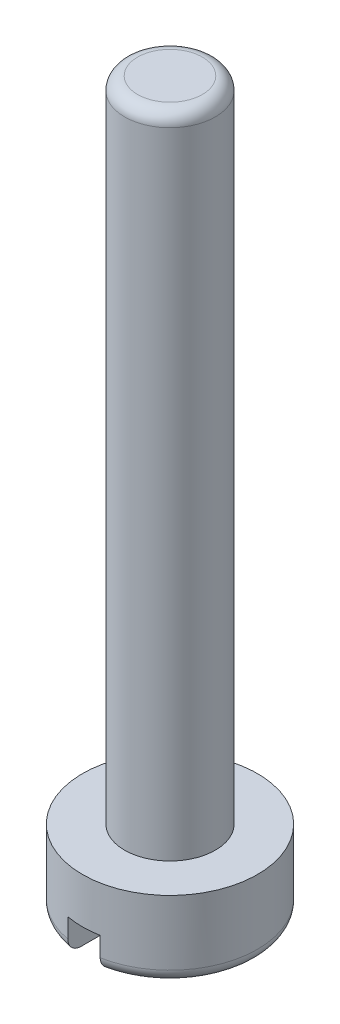
ISO-10303-21;
HEADER;
FILE_DESCRIPTION(('STEP AP214'),'2;1');
FILE_NAME('part.step','',(''),(''),'','','');
FILE_SCHEMA(('AUTOMOTIVE_DESIGN { 1 0 10303 214 1 1 1 1 }'));
ENDSEC;
DATA;
#1=APPLICATION_CONTEXT('core data for automotive mechanical design processes');
#2=APPLICATION_PROTOCOL_DEFINITION('international standard','automotive_design',2000,#1);
#3=PRODUCT_CONTEXT('',#1,'mechanical');
#4=PRODUCT('Part','Part','',(#3));
#5=PRODUCT_RELATED_PRODUCT_CATEGORY('part','',(#4));
#6=PRODUCT_DEFINITION_FORMATION('','',#4);
#7=PRODUCT_DEFINITION_CONTEXT('part definition',#1,'design');
#8=PRODUCT_DEFINITION('design','',#6,#7);
#9=PRODUCT_DEFINITION_SHAPE('','',#8);
#10=(LENGTH_UNIT() NAMED_UNIT(*) SI_UNIT(.MILLI.,.METRE.));
#11=(NAMED_UNIT(*) PLANE_ANGLE_UNIT() SI_UNIT($,.RADIAN.));
#12=(NAMED_UNIT(*) SI_UNIT($,.STERADIAN.) SOLID_ANGLE_UNIT());
#13=UNCERTAINTY_MEASURE_WITH_UNIT(LENGTH_MEASURE(1.E-05),#10,'distance_accuracy_value','');
#14=(GEOMETRIC_REPRESENTATION_CONTEXT(3) GLOBAL_UNCERTAINTY_ASSIGNED_CONTEXT((#13)) GLOBAL_UNIT_ASSIGNED_CONTEXT((#10,
#11,#12)) REPRESENTATION_CONTEXT('',''));
#15=CARTESIAN_POINT('',(0.,0.,0.));
#16=DIRECTION('',(0.,0.,1.));
#17=DIRECTION('',(1.,0.,0.));
#18=AXIS2_PLACEMENT_3D('',#15,#16,#17);
#19=CARTESIAN_POINT('',(0.,1.2,0.));
#20=DIRECTION('',(0.,-1.,0.));
#21=DIRECTION('',(0.,0.,-1.));
#22=AXIS2_PLACEMENT_3D('',#19,#20,#21);
#23=CYLINDRICAL_SURFACE('',#22,1.35);
#24=CARTESIAN_POINT('',(0.,1.2,0.));
#25=DIRECTION('',(0.,1.,0.));
#26=DIRECTION('',(0.,0.,1.));
#27=AXIS2_PLACEMENT_3D('',#24,#25,#26);
#28=CIRCLE('',#27,1.35);
#29=CARTESIAN_POINT('',(0.,1.2,1.35));
#30=VERTEX_POINT('',#29);
#31=EDGE_CURVE('E198',#30,#30,#28,.T.);
#32=ORIENTED_EDGE('',*,*,#31,.F.);
#33=EDGE_LOOP('',(#32));
#34=FACE_BOUND('',#33,.T.);
#35=DIRECTION('',(0.,-1.,0.));
#36=VECTOR('',#35,1.);
#37=CARTESIAN_POINT('',(0.249999999999999,1.2,1.32664991614216));
#38=LINE('',#37,#36);
#39=CARTESIAN_POINT('',(0.249999999999999,0.2,1.32664991614216));
#40=VERTEX_POINT('',#39);
#41=CARTESIAN_POINT('',(0.25,0.5,1.32664991614216));
#42=VERTEX_POINT('',#41);
#43=EDGE_CURVE('E84',#40,#42,#38,.F.);
#44=ORIENTED_EDGE('',*,*,#43,.F.);
#45=CARTESIAN_POINT('',(0.,0.2,0.));
#46=DIRECTION('',(0.,1.,0.));
#47=DIRECTION('',(0.,0.,1.));
#48=AXIS2_PLACEMENT_3D('',#45,#46,#47);
#49=CIRCLE('',#48,1.35);
#50=CARTESIAN_POINT('',(0.249999999999999,0.2,-1.32664991614216));
#51=VERTEX_POINT('',#50);
#52=EDGE_CURVE('E125',#40,#51,#49,.T.);
#53=ORIENTED_EDGE('',*,*,#52,.T.);
#54=DIRECTION('',(0.,-1.,0.));
#55=VECTOR('',#54,1.);
#56=CARTESIAN_POINT('',(0.249999999999999,1.2,-1.32664991614216));
#57=LINE('',#56,#55);
#58=CARTESIAN_POINT('',(0.25,0.5,-1.32664991614216));
#59=VERTEX_POINT('',#58);
#60=EDGE_CURVE('E97',#59,#51,#57,.T.);
#61=ORIENTED_EDGE('',*,*,#60,.F.);
#62=CARTESIAN_POINT('',(0.,0.5,0.));
#63=DIRECTION('',(0.,-1.,0.));
#64=DIRECTION('',(1.,0.,0.));
#65=AXIS2_PLACEMENT_3D('',#62,#63,#64);
#66=CIRCLE('',#65,1.35);
#67=CARTESIAN_POINT('',(-0.25,0.5,-1.32664991614216));
#68=VERTEX_POINT('',#67);
#69=EDGE_CURVE('E106',#68,#59,#66,.T.);
#70=ORIENTED_EDGE('',*,*,#69,.F.);
#71=DIRECTION('',(0.,-1.,0.));
#72=VECTOR('',#71,1.);
#73=CARTESIAN_POINT('',(-0.25,1.2,-1.32664991614216));
#74=LINE('',#73,#72);
#75=CARTESIAN_POINT('',(-0.25,0.2,-1.32664991614216));
#76=VERTEX_POINT('',#75);
#77=EDGE_CURVE('E192',#76,#68,#74,.F.);
#78=ORIENTED_EDGE('',*,*,#77,.F.);
#79=CARTESIAN_POINT('',(0.,0.2,0.));
#80=DIRECTION('',(0.,1.,0.));
#81=DIRECTION('',(0.,0.,1.));
#82=AXIS2_PLACEMENT_3D('',#79,#80,#81);
#83=CIRCLE('',#82,1.35);
#84=CARTESIAN_POINT('',(-0.25,0.2,1.32664991614216));
#85=VERTEX_POINT('',#84);
#86=EDGE_CURVE('E123',#76,#85,#83,.T.);
#87=ORIENTED_EDGE('',*,*,#86,.T.);
#88=DIRECTION('',(0.,-1.,0.));
#89=VECTOR('',#88,1.);
#90=CARTESIAN_POINT('',(-0.25,1.2,1.32664991614216));
#91=LINE('',#90,#89);
#92=CARTESIAN_POINT('',(-0.25,0.5,1.32664991614216));
#93=VERTEX_POINT('',#92);
#94=EDGE_CURVE('E110',#93,#85,#91,.T.);
#95=ORIENTED_EDGE('',*,*,#94,.F.);
#96=EDGE_CURVE('E103',#42,#93,#66,.T.);
#97=ORIENTED_EDGE('',*,*,#96,.F.);
#98=EDGE_LOOP('',(#44,#53,#61,#70,#78,#87,#95,#97));
#99=FACE_BOUND('',#98,.T.);
#100=ADVANCED_FACE('F33',(#34,#99),#23,.T.);
#101=CARTESIAN_POINT('',(0.,0.,0.));
#102=DIRECTION('',(0.,1.,0.));
#103=DIRECTION('',(0.,0.,1.));
#104=AXIS2_PLACEMENT_3D('',#101,#102,#103);
#105=PLANE('',#104);
#106=DIRECTION('',(0.,0.,-1.));
#107=VECTOR('',#106,1.);
#108=CARTESIAN_POINT('',(-0.25,0.,0.));
#109=LINE('',#108,#107);
#110=CARTESIAN_POINT('',(-0.25,0.,1.12249721603218));
#111=VERTEX_POINT('',#110);
#112=CARTESIAN_POINT('',(-0.25,0.,-1.12249721603218));
#113=VERTEX_POINT('',#112);
#114=EDGE_CURVE('E111',#111,#113,#109,.T.);
#115=ORIENTED_EDGE('',*,*,#114,.F.);
#116=CARTESIAN_POINT('',(0.,0.,0.));
#117=DIRECTION('',(0.,1.,0.));
#118=DIRECTION('',(0.,0.,1.));
#119=AXIS2_PLACEMENT_3D('',#116,#117,#118);
#120=CIRCLE('',#119,1.15);
#121=EDGE_CURVE('E11',#111,#113,#120,.F.);
#122=ORIENTED_EDGE('',*,*,#121,.T.);
#123=EDGE_LOOP('',(#115,#122));
#124=FACE_BOUND('',#123,.T.);
#125=ADVANCED_FACE('F153',(#124),#105,.F.);
#126=DIRECTION('',(0.,0.,1.));
#127=VECTOR('',#126,1.);
#128=CARTESIAN_POINT('',(0.25,0.,0.));
#129=LINE('',#128,#127);
#130=CARTESIAN_POINT('',(0.25,0.,-1.12249721603218));
#131=VERTEX_POINT('',#130);
#132=CARTESIAN_POINT('',(0.25,0.,1.12249721603218));
#133=VERTEX_POINT('',#132);
#134=EDGE_CURVE('E114',#131,#133,#129,.T.);
#135=ORIENTED_EDGE('',*,*,#134,.F.);
#136=CARTESIAN_POINT('',(0.,0.,0.));
#137=DIRECTION('',(0.,1.,0.));
#138=DIRECTION('',(0.,0.,1.));
#139=AXIS2_PLACEMENT_3D('',#136,#137,#138);
#140=CIRCLE('',#139,1.15);
#141=EDGE_CURVE('E185',#131,#133,#140,.F.);
#142=ORIENTED_EDGE('',*,*,#141,.T.);
#143=EDGE_LOOP('',(#135,#142));
#144=FACE_BOUND('',#143,.T.);
#145=ADVANCED_FACE('F157',(#144),#105,.F.);
#146=CARTESIAN_POINT('',(0.,1.2,0.));
#147=DIRECTION('',(0.,1.,0.));
#148=DIRECTION('',(0.,0.,1.));
#149=AXIS2_PLACEMENT_3D('',#146,#147,#148);
#150=PLANE('',#149);
#151=CARTESIAN_POINT('',(0.,1.2,0.));
#152=DIRECTION('',(0.,1.,0.));
#153=DIRECTION('',(0.,0.,1.));
#154=AXIS2_PLACEMENT_3D('',#151,#152,#153);
#155=CIRCLE('',#154,0.7);
#156=CARTESIAN_POINT('',(0.,1.2,0.7));
#157=VERTEX_POINT('',#156);
#158=EDGE_CURVE('E191',#157,#157,#155,.T.);
#159=ORIENTED_EDGE('',*,*,#158,.F.);
#160=EDGE_LOOP('',(#159));
#161=FACE_BOUND('',#160,.T.);
#162=ORIENTED_EDGE('',*,*,#31,.T.);
#163=EDGE_LOOP('',(#162));
#164=FACE_BOUND('',#163,.T.);
#165=ADVANCED_FACE('F158',(#161,#164),#150,.T.);
#166=CARTESIAN_POINT('',(0.,11.2,0.));
#167=DIRECTION('',(0.,-1.,0.));
#168=DIRECTION('',(0.,0.,-1.));
#169=AXIS2_PLACEMENT_3D('',#166,#167,#168);
#170=CYLINDRICAL_SURFACE('',#169,0.7);
#171=CARTESIAN_POINT('',(0.,11.,0.));
#172=DIRECTION('',(0.,1.,0.));
#173=DIRECTION('',(0.,0.,1.));
#174=AXIS2_PLACEMENT_3D('',#171,#172,#173);
#175=CIRCLE('',#174,0.7);
#176=CARTESIAN_POINT('',(0.,11.,0.7));
#177=VERTEX_POINT('',#176);
#178=EDGE_CURVE('E120',#177,#177,#175,.F.);
#179=ORIENTED_EDGE('',*,*,#178,.T.);
#180=EDGE_LOOP('',(#179));
#181=FACE_BOUND('',#180,.T.);
#182=ORIENTED_EDGE('',*,*,#158,.T.);
#183=EDGE_LOOP('',(#182));
#184=FACE_BOUND('',#183,.T.);
#185=ADVANCED_FACE('F161',(#181,#184),#170,.T.);
#186=CARTESIAN_POINT('',(0.,11.2,0.));
#187=DIRECTION('',(0.,1.,0.));
#188=DIRECTION('',(0.,0.,1.));
#189=AXIS2_PLACEMENT_3D('',#186,#187,#188);
#190=PLANE('',#189);
#191=CARTESIAN_POINT('',(0.,11.2,0.));
#192=DIRECTION('',(0.,1.,0.));
#193=DIRECTION('',(0.,0.,1.));
#194=AXIS2_PLACEMENT_3D('',#191,#192,#193);
#195=CIRCLE('',#194,0.5);
#196=CARTESIAN_POINT('',(0.,11.2,0.5));
#197=VERTEX_POINT('',#196);
#198=EDGE_CURVE('E113',#197,#197,#195,.T.);
#199=ORIENTED_EDGE('',*,*,#198,.T.);
#200=EDGE_LOOP('',(#199));
#201=FACE_BOUND('',#200,.T.);
#202=ADVANCED_FACE('F165',(#201),#190,.T.);
#203=CARTESIAN_POINT('',(-0.25,0.5,10.));
#204=DIRECTION('',(0.,-1.,0.));
#205=DIRECTION('',(1.,0.,0.));
#206=AXIS2_PLACEMENT_3D('',#203,#204,#205);
#207=PLANE('',#206);
#208=ORIENTED_EDGE('',*,*,#96,.T.);
#209=DIRECTION('',(0.,0.,-1.));
#210=VECTOR('',#209,1.);
#211=CARTESIAN_POINT('',(-0.25,0.5,10.));
#212=LINE('',#211,#210);
#213=EDGE_CURVE('E98',#93,#68,#212,.T.);
#214=ORIENTED_EDGE('',*,*,#213,.T.);
#215=ORIENTED_EDGE('',*,*,#69,.T.);
#216=DIRECTION('',(0.,0.,-1.));
#217=VECTOR('',#216,1.);
#218=CARTESIAN_POINT('',(0.25,0.5,10.));
#219=LINE('',#218,#217);
#220=EDGE_CURVE('E88',#42,#59,#219,.T.);
#221=ORIENTED_EDGE('',*,*,#220,.F.);
#222=EDGE_LOOP('',(#208,#214,#215,#221));
#223=FACE_BOUND('',#222,.T.);
#224=ADVANCED_FACE('F101',(#223),#207,.T.);
#225=CARTESIAN_POINT('',(-0.25,0.,10.));
#226=DIRECTION('',(1.,0.,0.));
#227=DIRECTION('',(0.,0.,-1.));
#228=AXIS2_PLACEMENT_3D('',#225,#226,#227);
#229=PLANE('',#228);
#230=ORIENTED_EDGE('',*,*,#94,.T.);
#231=CARTESIAN_POINT('',(-0.25,0.2,1.32664991614216));
#232=CARTESIAN_POINT('',(-0.25,0.188895601933147,1.32666016365222));
#233=CARTESIAN_POINT('',(-0.25,0.177795047926557,1.32570947939347));
#234=CARTESIAN_POINT('',(-0.25,0.155923258231284,1.32196302073898));
#235=CARTESIAN_POINT('',(-0.25,0.145151634411462,1.31916951640825));
#236=CARTESIAN_POINT('',(-0.25,0.124227026228868,1.31181262098853));
#237=CARTESIAN_POINT('',(-0.25,0.114074249373021,1.30724863997385));
#238=CARTESIAN_POINT('',(-0.25,0.0946727114080624,1.29649320106179));
#239=CARTESIAN_POINT('',(-0.25,0.0854239013917694,1.29030183127771));
#240=CARTESIAN_POINT('',(-0.25,0.0680195241503603,1.2764274731746));
#241=CARTESIAN_POINT('',(-0.25,0.0598718220624366,1.26873462418864));
#242=CARTESIAN_POINT('',(-0.25,0.0449569896283195,1.25210892695446));
#243=CARTESIAN_POINT('',(-0.25,0.0381901330650912,1.24317583338935));
#244=CARTESIAN_POINT('',(-0.25,0.0261077062318632,1.22416712979596));
#245=CARTESIAN_POINT('',(-0.25,0.020818291904864,1.21407491486536));
#246=CARTESIAN_POINT('',(-0.25,0.0119729521021912,1.19315843345768));
#247=CARTESIAN_POINT('',(-0.25,0.00841661239592321,1.18233434261484));
#248=CARTESIAN_POINT('',(-0.25,0.00384845821106549,1.1633085125841));
#249=CARTESIAN_POINT('',(-0.25,0.00240529491677701,1.15520735348097));
#250=CARTESIAN_POINT('',(-0.25,0.000481103450687367,1.13890397469775));
#251=CARTESIAN_POINT('',(-0.25,-1.37972616779506E-06,1.13070192680795));
#252=CARTESIAN_POINT('',(-0.25,-2.31170171540456E-12,1.12249721603274));
#253=B_SPLINE_CURVE_WITH_KNOTS('',3,(#231,#232,#233,#234,#235,#236,#237,#238,#239,#240,#241,
#242,#243,#244,#245,#246,#247,#248,#249,#250,#251,#252),.UNSPECIFIED.,.F.,.F.,(4,2,2,2,2,2,2,2,
2,2,4),(0.,0.0332668735459216,0.0664928438579697,0.0997298946393503,0.132965146205002,
0.166426490755115,0.199894463319506,0.233921994541195,0.267941388683249,0.292573325929809,
0.317167928232879),.UNSPECIFIED.);
#254=EDGE_CURVE('E42',#85,#111,#253,.T.);
#255=ORIENTED_EDGE('',*,*,#254,.T.);
#256=ORIENTED_EDGE('',*,*,#114,.T.);
#257=CARTESIAN_POINT('',(-0.25,0.,-1.12249721603218));
#258=CARTESIAN_POINT('',(-0.25,-9.09205358196936E-06,-1.1341747566991));
#259=CARTESIAN_POINT('',(-0.25,0.000973936207482793,-1.1458522311877));
#260=CARTESIAN_POINT('',(-0.25,0.00486908415488938,-1.16888107578838));
#261=CARTESIAN_POINT('',(-0.25,0.00778123404535707,-1.18023244079168));
#262=CARTESIAN_POINT('',(-0.25,0.0154828122844086,-1.20229227345012));
#263=CARTESIAN_POINT('',(-0.25,0.0202738671247057,-1.21300017479822));
#264=CARTESIAN_POINT('',(-0.25,0.031607974437431,-1.23343992832113));
#265=CARTESIAN_POINT('',(-0.25,0.0381502609221364,-1.2431722046817));
#266=CARTESIAN_POINT('',(-0.25,0.0527118912346013,-1.26124177569014));
#267=CARTESIAN_POINT('',(-0.25,0.0607098034432311,-1.26959633314017));
#268=CARTESIAN_POINT('',(-0.25,0.078022227095534,-1.28481317965415));
#269=CARTESIAN_POINT('',(-0.25,0.0873369610966178,-1.29167521596685));
#270=CARTESIAN_POINT('',(-0.25,0.106819154124001,-1.30356847432499));
#271=CARTESIAN_POINT('',(-0.25,0.116966443881206,-1.30863278693539));
#272=CARTESIAN_POINT('',(-0.25,0.137973065959638,-1.31695273664094));
#273=CARTESIAN_POINT('',(-0.25,0.148831782172124,-1.32020991619098));
#274=CARTESIAN_POINT('',(-0.25,0.166479331201269,-1.323888339925));
#275=CARTESIAN_POINT('',(-0.25,0.173146197951868,-1.32492340636932));
#276=CARTESIAN_POINT('',(-0.25,0.186541001960041,-1.32630396573516));
#277=CARTESIAN_POINT('',(-0.25,0.193268834777638,-1.32665047230427));
#278=CARTESIAN_POINT('',(-0.25,0.199999999999902,-1.32664991614263));
#279=B_SPLINE_CURVE_WITH_KNOTS('',3,(#257,#258,#259,#260,#261,#262,#263,#264,#265,#266,#267,
#268,#269,#270,#271,#272,#273,#274,#275,#276,#277,#278),.UNSPECIFIED.,.F.,.F.,(4,2,2,2,2,2,2,2,
2,2,4),(0.,0.0349915206123973,0.0699835890975971,0.105006015897456,0.140013148868794,
0.174541360258321,0.209075414288707,0.242936076885989,0.276767793517714,0.296975625987044,
0.317153687856336),.UNSPECIFIED.);
#280=EDGE_CURVE('E176',#113,#76,#279,.T.);
#281=ORIENTED_EDGE('',*,*,#280,.T.);
#282=ORIENTED_EDGE('',*,*,#77,.T.);
#283=ORIENTED_EDGE('',*,*,#213,.F.);
#284=EDGE_LOOP('',(#230,#255,#256,#281,#282,#283));
#285=FACE_BOUND('',#284,.T.);
#286=ADVANCED_FACE('F171',(#285),#229,.T.);
#287=CARTESIAN_POINT('',(0.25,0.5,10.));
#288=DIRECTION('',(-1.,0.,0.));
#289=DIRECTION('',(0.,-1.,0.));
#290=AXIS2_PLACEMENT_3D('',#287,#288,#289);
#291=PLANE('',#290);
#292=ORIENTED_EDGE('',*,*,#60,.T.);
#293=CARTESIAN_POINT('',(0.249999999999999,0.2,-1.32664991614216));
#294=CARTESIAN_POINT('',(0.25,0.188895601933147,-1.32666016365222));
#295=CARTESIAN_POINT('',(0.25,0.177795047926557,-1.32570947939347));
#296=CARTESIAN_POINT('',(0.25,0.155923258231284,-1.32196302073898));
#297=CARTESIAN_POINT('',(0.25,0.145151634411462,-1.31916951640825));
#298=CARTESIAN_POINT('',(0.25,0.124227026228868,-1.31181262098853));
#299=CARTESIAN_POINT('',(0.25,0.114074249373021,-1.30724863997385));
#300=CARTESIAN_POINT('',(0.25,0.0946727114080624,-1.29649320106179));
#301=CARTESIAN_POINT('',(0.25,0.0854239013917694,-1.29030183127771));
#302=CARTESIAN_POINT('',(0.25,0.0680195241503603,-1.2764274731746));
#303=CARTESIAN_POINT('',(0.25,0.0598718220624366,-1.26873462418864));
#304=CARTESIAN_POINT('',(0.25,0.0449569896283194,-1.25210892695446));
#305=CARTESIAN_POINT('',(0.25,0.0381901330650911,-1.24317583338935));
#306=CARTESIAN_POINT('',(0.25,0.026107706231863,-1.22416712979596));
#307=CARTESIAN_POINT('',(0.25,0.0208182919048639,-1.21407491486536));
#308=CARTESIAN_POINT('',(0.25,0.0119729521021912,-1.19315843345768));
#309=CARTESIAN_POINT('',(0.25,0.00841661239592317,-1.18233434261484));
#310=CARTESIAN_POINT('',(0.25,0.00384845821106548,-1.1633085125841));
#311=CARTESIAN_POINT('',(0.25,0.002405294916777,-1.15520735348097));
#312=CARTESIAN_POINT('',(0.25,0.000481103450687372,-1.13890397469775));
#313=CARTESIAN_POINT('',(0.25,-1.37972616779008E-06,-1.13070192680795));
#314=CARTESIAN_POINT('',(0.25,-2.31171272683287E-12,-1.12249721603274));
#315=B_SPLINE_CURVE_WITH_KNOTS('',3,(#293,#294,#295,#296,#297,#298,#299,#300,#301,#302,#303,
#304,#305,#306,#307,#308,#309,#310,#311,#312,#313,#314),.UNSPECIFIED.,.F.,.F.,(4,2,2,2,2,2,2,2,
2,2,4),(0.,0.0332668735459215,0.0664928438579696,0.0997298946393502,0.132965146205002,
0.166426490755115,0.199894463319507,0.233921994541195,0.267941388683249,0.292573325929809,
0.317167928232879),.UNSPECIFIED.);
#316=EDGE_CURVE('E133',#51,#131,#315,.T.);
#317=ORIENTED_EDGE('',*,*,#316,.T.);
#318=ORIENTED_EDGE('',*,*,#134,.T.);
#319=CARTESIAN_POINT('',(0.25,0.,1.12249721603218));
#320=CARTESIAN_POINT('',(0.25,-9.09205358197259E-06,1.1341747566991));
#321=CARTESIAN_POINT('',(0.25,0.000973936207482791,1.1458522311877));
#322=CARTESIAN_POINT('',(0.25,0.00486908415488938,1.16888107578838));
#323=CARTESIAN_POINT('',(0.25,0.00778123404535707,1.18023244079168));
#324=CARTESIAN_POINT('',(0.25,0.0154828122844086,1.20229227345012));
#325=CARTESIAN_POINT('',(0.25,0.0202738671247057,1.21300017479822));
#326=CARTESIAN_POINT('',(0.25,0.031607974437431,1.23343992832113));
#327=CARTESIAN_POINT('',(0.25,0.0381502609221364,1.2431722046817));
#328=CARTESIAN_POINT('',(0.25,0.0527118912346013,1.26124177569014));
#329=CARTESIAN_POINT('',(0.25,0.0607098034432311,1.26959633314017));
#330=CARTESIAN_POINT('',(0.25,0.078022227095534,1.28481317965415));
#331=CARTESIAN_POINT('',(0.25,0.0873369610966178,1.29167521596685));
#332=CARTESIAN_POINT('',(0.25,0.106819154124001,1.30356847432499));
#333=CARTESIAN_POINT('',(0.25,0.116966443881206,1.30863278693539));
#334=CARTESIAN_POINT('',(0.25,0.137973065959638,1.31695273664094));
#335=CARTESIAN_POINT('',(0.25,0.148831782172124,1.32020991619098));
#336=CARTESIAN_POINT('',(0.25,0.16647933120127,1.323888339925));
#337=CARTESIAN_POINT('',(0.25,0.173146197951868,1.32492340636932));
#338=CARTESIAN_POINT('',(0.25,0.186541001960041,1.32630396573516));
#339=CARTESIAN_POINT('',(0.25,0.193268834777639,1.32665047230427));
#340=CARTESIAN_POINT('',(0.25,0.199999999999902,1.32664991614263));
#341=B_SPLINE_CURVE_WITH_KNOTS('',3,(#319,#320,#321,#322,#323,#324,#325,#326,#327,#328,#329,
#330,#331,#332,#333,#334,#335,#336,#337,#338,#339,#340),.UNSPECIFIED.,.F.,.F.,(4,2,2,2,2,2,2,2,
2,2,4),(0.,0.0349915206123973,0.0699835890975971,0.105006015897456,0.140013148868794,
0.174541360258321,0.209075414288707,0.242936076885989,0.276767793517714,0.296975625987044,
0.317153687856336),.UNSPECIFIED.);
#342=EDGE_CURVE('E92',#133,#40,#341,.T.);
#343=ORIENTED_EDGE('',*,*,#342,.T.);
#344=ORIENTED_EDGE('',*,*,#43,.T.);
#345=ORIENTED_EDGE('',*,*,#220,.T.);
#346=EDGE_LOOP('',(#292,#317,#318,#343,#344,#345));
#347=FACE_BOUND('',#346,.T.);
#348=ADVANCED_FACE('F87',(#347),#291,.T.);
#349=CARTESIAN_POINT('',(0.,11.,0.));
#350=DIRECTION('',(0.,1.,0.));
#351=DIRECTION('',(0.,0.,1.));
#352=AXIS2_PLACEMENT_3D('',#349,#350,#351);
#353=TOROIDAL_SURFACE('',#352,0.5,0.2);
#354=ORIENTED_EDGE('',*,*,#178,.F.);
#355=EDGE_LOOP('',(#354));
#356=FACE_BOUND('',#355,.T.);
#357=ORIENTED_EDGE('',*,*,#198,.F.);
#358=EDGE_LOOP('',(#357));
#359=FACE_BOUND('',#358,.T.);
#360=ADVANCED_FACE('F145',(#356,#359),#353,.T.);
#361=CARTESIAN_POINT('',(0.,0.2,0.));
#362=DIRECTION('',(0.,1.,0.));
#363=DIRECTION('',(0.,0.,1.));
#364=AXIS2_PLACEMENT_3D('',#361,#362,#363);
#365=TOROIDAL_SURFACE('',#364,1.15,0.2);
#366=ORIENTED_EDGE('',*,*,#342,.F.);
#367=ORIENTED_EDGE('',*,*,#141,.F.);
#368=ORIENTED_EDGE('',*,*,#316,.F.);
#369=ORIENTED_EDGE('',*,*,#52,.F.);
#370=EDGE_LOOP('',(#366,#367,#368,#369));
#371=FACE_BOUND('',#370,.T.);
#372=ADVANCED_FACE('F141',(#371),#365,.T.);
#373=CARTESIAN_POINT('',(0.,0.2,0.));
#374=DIRECTION('',(0.,1.,0.));
#375=DIRECTION('',(0.,0.,1.));
#376=AXIS2_PLACEMENT_3D('',#373,#374,#375);
#377=TOROIDAL_SURFACE('',#376,1.15,0.2);
#378=ORIENTED_EDGE('',*,*,#280,.F.);
#379=ORIENTED_EDGE('',*,*,#121,.F.);
#380=ORIENTED_EDGE('',*,*,#254,.F.);
#381=ORIENTED_EDGE('',*,*,#86,.F.);
#382=EDGE_LOOP('',(#378,#379,#380,#381));
#383=FACE_BOUND('',#382,.T.);
#384=ADVANCED_FACE('F35',(#383),#377,.T.);
#385=CLOSED_SHELL('',(#100,#125,#145,#165,#185,#202,#224,#286,#348,#360,#372,#384));
#386=MANIFOLD_SOLID_BREP('B2',#385);
#387=ADVANCED_BREP_SHAPE_REPRESENTATION('',(#18,#386),#14);
#388=SHAPE_DEFINITION_REPRESENTATION(#9,#387);
ENDSEC;
END-ISO-10303-21;
